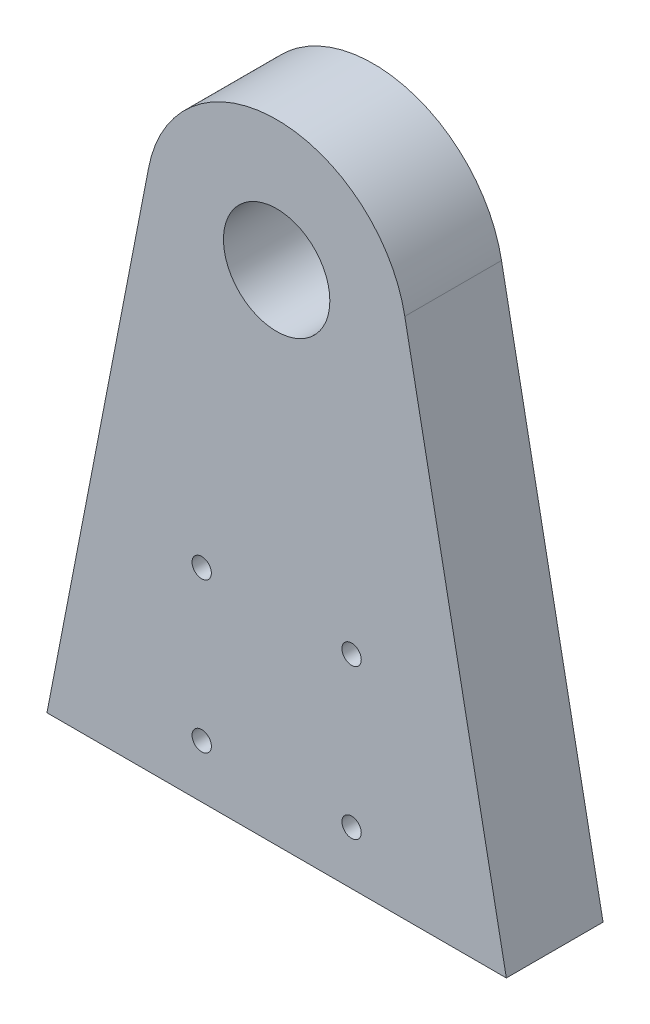
ISO-10303-21;
HEADER;
FILE_DESCRIPTION(('STEP AP214'),'2;1');
FILE_NAME('part.step','',(''),(''),'','','');
FILE_SCHEMA(('AUTOMOTIVE_DESIGN { 1 0 10303 214 1 1 1 1 }'));
ENDSEC;
DATA;
#1=APPLICATION_CONTEXT('core data for automotive mechanical design processes');
#2=APPLICATION_PROTOCOL_DEFINITION('international standard','automotive_design',2000,#1);
#3=PRODUCT_CONTEXT('',#1,'mechanical');
#4=PRODUCT('Part','Part','',(#3));
#5=PRODUCT_RELATED_PRODUCT_CATEGORY('part','',(#4));
#6=PRODUCT_DEFINITION_FORMATION('','',#4);
#7=PRODUCT_DEFINITION_CONTEXT('part definition',#1,'design');
#8=PRODUCT_DEFINITION('design','',#6,#7);
#9=PRODUCT_DEFINITION_SHAPE('','',#8);
#10=(LENGTH_UNIT() NAMED_UNIT(*) SI_UNIT(.MILLI.,.METRE.));
#11=(NAMED_UNIT(*) PLANE_ANGLE_UNIT() SI_UNIT($,.RADIAN.));
#12=(NAMED_UNIT(*) SI_UNIT($,.STERADIAN.) SOLID_ANGLE_UNIT());
#13=UNCERTAINTY_MEASURE_WITH_UNIT(LENGTH_MEASURE(1.E-05),#10,'distance_accuracy_value','');
#14=(GEOMETRIC_REPRESENTATION_CONTEXT(3) GLOBAL_UNCERTAINTY_ASSIGNED_CONTEXT((#13)) GLOBAL_UNIT_ASSIGNED_CONTEXT((#10,
#11,#12)) REPRESENTATION_CONTEXT('',''));
#15=CARTESIAN_POINT('',(0.,0.,0.));
#16=DIRECTION('',(0.,0.,1.));
#17=DIRECTION('',(1.,0.,0.));
#18=AXIS2_PLACEMENT_3D('',#15,#16,#17);
#19=CARTESIAN_POINT('',(47.5,103.039772727273,20.));
#20=DIRECTION('',(0.,0.,1.));
#21=DIRECTION('',(1.,0.,0.));
#22=AXIS2_PLACEMENT_3D('',#19,#20,#21);
#23=PLANE('',#22);
#24=CARTESIAN_POINT('',(62.9999999999999,42.,20.));
#25=DIRECTION('',(0.,0.,1.));
#26=DIRECTION('',(1.,0.,0.));
#27=AXIS2_PLACEMENT_3D('',#24,#25,#26);
#28=CIRCLE('',#27,2.);
#29=CARTESIAN_POINT('',(64.9999999999999,42.,20.));
#30=VERTEX_POINT('',#29);
#31=EDGE_CURVE('E137',#30,#30,#28,.T.);
#32=ORIENTED_EDGE('',*,*,#31,.F.);
#33=EDGE_LOOP('',(#32));
#34=FACE_BOUND('',#33,.T.);
#35=CARTESIAN_POINT('',(31.9999999999999,41.9999999999998,20.));
#36=DIRECTION('',(0.,0.,1.));
#37=DIRECTION('',(1.,0.,0.));
#38=AXIS2_PLACEMENT_3D('',#35,#36,#37);
#39=CIRCLE('',#38,2.);
#40=CARTESIAN_POINT('',(33.9999999999999,41.9999999999998,20.));
#41=VERTEX_POINT('',#40);
#42=EDGE_CURVE('E143',#41,#41,#39,.T.);
#43=ORIENTED_EDGE('',*,*,#42,.F.);
#44=EDGE_LOOP('',(#43));
#45=FACE_BOUND('',#44,.T.);
#46=CARTESIAN_POINT('',(32.,10.9999999999998,20.));
#47=DIRECTION('',(0.,0.,1.));
#48=DIRECTION('',(1.,0.,0.));
#49=AXIS2_PLACEMENT_3D('',#46,#47,#48);
#50=CIRCLE('',#49,2.);
#51=CARTESIAN_POINT('',(34.,10.9999999999998,20.));
#52=VERTEX_POINT('',#51);
#53=EDGE_CURVE('E149',#52,#52,#50,.T.);
#54=ORIENTED_EDGE('',*,*,#53,.F.);
#55=EDGE_LOOP('',(#54));
#56=FACE_BOUND('',#55,.T.);
#57=CARTESIAN_POINT('',(63.,11.,20.));
#58=DIRECTION('',(0.,0.,1.));
#59=DIRECTION('',(1.,0.,0.));
#60=AXIS2_PLACEMENT_3D('',#57,#58,#59);
#61=CIRCLE('',#60,2.);
#62=CARTESIAN_POINT('',(65.,11.,20.));
#63=VERTEX_POINT('',#62);
#64=EDGE_CURVE('E131',#63,#63,#61,.T.);
#65=ORIENTED_EDGE('',*,*,#64,.F.);
#66=EDGE_LOOP('',(#65));
#67=FACE_BOUND('',#66,.T.);
#68=DIRECTION('',(-0.190869659102224,-0.981615389668582,0.));
#69=VECTOR('',#68,1.);
#70=CARTESIAN_POINT('',(21.,108.,20.));
#71=LINE('',#70,#69);
#72=CARTESIAN_POINT('',(21.,108.,20.));
#73=VERTEX_POINT('',#72);
#74=CARTESIAN_POINT('',(0.,0.,20.));
#75=VERTEX_POINT('',#74);
#76=EDGE_CURVE('E98',#73,#75,#71,.T.);
#77=ORIENTED_EDGE('',*,*,#76,.T.);
#78=DIRECTION('',(1.,0.,0.));
#79=VECTOR('',#78,1.);
#80=CARTESIAN_POINT('',(0.,0.,20.));
#81=LINE('',#80,#79);
#82=CARTESIAN_POINT('',(95.,0.,20.));
#83=VERTEX_POINT('',#82);
#84=EDGE_CURVE('E93',#75,#83,#81,.T.);
#85=ORIENTED_EDGE('',*,*,#84,.T.);
#86=DIRECTION('',(-0.190869659102224,0.981615389668581,0.));
#87=VECTOR('',#86,1.);
#88=CARTESIAN_POINT('',(95.,0.,20.));
#89=LINE('',#88,#87);
#90=CARTESIAN_POINT('',(74.,108.,20.));
#91=VERTEX_POINT('',#90);
#92=EDGE_CURVE('E96',#83,#91,#89,.T.);
#93=ORIENTED_EDGE('',*,*,#92,.T.);
#94=CARTESIAN_POINT('',(47.5,103.039772727273,20.));
#95=DIRECTION('',(0.,0.,1.));
#96=DIRECTION('',(1.,0.,0.));
#97=AXIS2_PLACEMENT_3D('',#94,#95,#96);
#98=CIRCLE('',#97,26.9602272727273);
#99=EDGE_CURVE('E63',#91,#73,#98,.T.);
#100=ORIENTED_EDGE('',*,*,#99,.T.);
#101=EDGE_LOOP('',(#77,#85,#93,#100));
#102=FACE_BOUND('',#101,.T.);
#103=CARTESIAN_POINT('',(47.5,103.039772727273,20.));
#104=DIRECTION('',(0.,0.,1.));
#105=DIRECTION('',(1.,0.,0.));
#106=AXIS2_PLACEMENT_3D('',#103,#104,#105);
#107=CIRCLE('',#106,11.);
#108=CARTESIAN_POINT('',(58.5,103.039772727273,20.));
#109=VERTEX_POINT('',#108);
#110=EDGE_CURVE('E113',#109,#109,#107,.T.);
#111=ORIENTED_EDGE('',*,*,#110,.F.);
#112=EDGE_LOOP('',(#111));
#113=FACE_BOUND('',#112,.T.);
#114=ADVANCED_FACE('F46',(#34,#45,#56,#67,#102,#113),#23,.T.);
#115=CARTESIAN_POINT('',(47.5,103.039772727273,0.));
#116=DIRECTION('',(0.,0.,1.));
#117=DIRECTION('',(1.,0.,0.));
#118=AXIS2_PLACEMENT_3D('',#115,#116,#117);
#119=PLANE('',#118);
#120=CARTESIAN_POINT('',(62.9999999999999,42.,0.));
#121=DIRECTION('',(0.,0.,1.));
#122=DIRECTION('',(1.,0.,0.));
#123=AXIS2_PLACEMENT_3D('',#120,#121,#122);
#124=CIRCLE('',#123,2.);
#125=CARTESIAN_POINT('',(64.9999999999999,42.,0.));
#126=VERTEX_POINT('',#125);
#127=EDGE_CURVE('E140',#126,#126,#124,.T.);
#128=ORIENTED_EDGE('',*,*,#127,.T.);
#129=EDGE_LOOP('',(#128));
#130=FACE_BOUND('',#129,.T.);
#131=CARTESIAN_POINT('',(31.9999999999999,41.9999999999998,0.));
#132=DIRECTION('',(0.,0.,1.));
#133=DIRECTION('',(1.,0.,0.));
#134=AXIS2_PLACEMENT_3D('',#131,#132,#133);
#135=CIRCLE('',#134,2.);
#136=CARTESIAN_POINT('',(33.9999999999999,41.9999999999998,0.));
#137=VERTEX_POINT('',#136);
#138=EDGE_CURVE('E146',#137,#137,#135,.T.);
#139=ORIENTED_EDGE('',*,*,#138,.T.);
#140=EDGE_LOOP('',(#139));
#141=FACE_BOUND('',#140,.T.);
#142=CARTESIAN_POINT('',(32.,10.9999999999998,0.));
#143=DIRECTION('',(0.,0.,1.));
#144=DIRECTION('',(1.,0.,0.));
#145=AXIS2_PLACEMENT_3D('',#142,#143,#144);
#146=CIRCLE('',#145,2.);
#147=CARTESIAN_POINT('',(34.,10.9999999999998,0.));
#148=VERTEX_POINT('',#147);
#149=EDGE_CURVE('E134',#148,#148,#146,.T.);
#150=ORIENTED_EDGE('',*,*,#149,.T.);
#151=EDGE_LOOP('',(#150));
#152=FACE_BOUND('',#151,.T.);
#153=CARTESIAN_POINT('',(63.,11.,0.));
#154=DIRECTION('',(0.,0.,1.));
#155=DIRECTION('',(1.,0.,0.));
#156=AXIS2_PLACEMENT_3D('',#153,#154,#155);
#157=CIRCLE('',#156,2.);
#158=CARTESIAN_POINT('',(65.,11.,0.));
#159=VERTEX_POINT('',#158);
#160=EDGE_CURVE('E128',#159,#159,#157,.T.);
#161=ORIENTED_EDGE('',*,*,#160,.T.);
#162=EDGE_LOOP('',(#161));
#163=FACE_BOUND('',#162,.T.);
#164=DIRECTION('',(-0.190869659102224,-0.981615389668582,0.));
#165=VECTOR('',#164,1.);
#166=CARTESIAN_POINT('',(21.,108.,0.));
#167=LINE('',#166,#165);
#168=CARTESIAN_POINT('',(21.,108.,0.));
#169=VERTEX_POINT('',#168);
#170=CARTESIAN_POINT('',(0.,0.,0.));
#171=VERTEX_POINT('',#170);
#172=EDGE_CURVE('E110',#169,#171,#167,.T.);
#173=ORIENTED_EDGE('',*,*,#172,.F.);
#174=CARTESIAN_POINT('',(47.5,103.039772727273,0.));
#175=DIRECTION('',(0.,0.,1.));
#176=DIRECTION('',(1.,0.,0.));
#177=AXIS2_PLACEMENT_3D('',#174,#175,#176);
#178=CIRCLE('',#177,26.9602272727273);
#179=CARTESIAN_POINT('',(74.,108.,0.));
#180=VERTEX_POINT('',#179);
#181=EDGE_CURVE('E86',#180,#169,#178,.T.);
#182=ORIENTED_EDGE('',*,*,#181,.F.);
#183=DIRECTION('',(-0.190869659102224,0.981615389668581,0.));
#184=VECTOR('',#183,1.);
#185=CARTESIAN_POINT('',(95.,0.,0.));
#186=LINE('',#185,#184);
#187=CARTESIAN_POINT('',(95.,0.,0.));
#188=VERTEX_POINT('',#187);
#189=EDGE_CURVE('E80',#188,#180,#186,.T.);
#190=ORIENTED_EDGE('',*,*,#189,.F.);
#191=DIRECTION('',(1.,0.,0.));
#192=VECTOR('',#191,1.);
#193=CARTESIAN_POINT('',(0.,0.,0.));
#194=LINE('',#193,#192);
#195=EDGE_CURVE('E102',#171,#188,#194,.T.);
#196=ORIENTED_EDGE('',*,*,#195,.F.);
#197=EDGE_LOOP('',(#173,#182,#190,#196));
#198=FACE_BOUND('',#197,.T.);
#199=CARTESIAN_POINT('',(47.5,103.039772727273,0.));
#200=DIRECTION('',(0.,0.,1.));
#201=DIRECTION('',(1.,0.,0.));
#202=AXIS2_PLACEMENT_3D('',#199,#200,#201);
#203=CIRCLE('',#202,11.);
#204=CARTESIAN_POINT('',(58.5,103.039772727273,0.));
#205=VERTEX_POINT('',#204);
#206=EDGE_CURVE('E125',#205,#205,#203,.T.);
#207=ORIENTED_EDGE('',*,*,#206,.T.);
#208=EDGE_LOOP('',(#207));
#209=FACE_BOUND('',#208,.T.);
#210=ADVANCED_FACE('F121',(#130,#141,#152,#163,#198,#209),#119,.F.);
#211=CARTESIAN_POINT('',(21.,108.,20.));
#212=DIRECTION('',(0.981615389668581,-0.190869659102224,0.));
#213=DIRECTION('',(0.190869659102224,0.981615389668581,0.));
#214=AXIS2_PLACEMENT_3D('',#211,#212,#213);
#215=PLANE('',#214);
#216=ORIENTED_EDGE('',*,*,#172,.T.);
#217=DIRECTION('',(0.,0.,-1.));
#218=VECTOR('',#217,1.);
#219=CARTESIAN_POINT('',(0.,0.,20.));
#220=LINE('',#219,#218);
#221=EDGE_CURVE('E13',#75,#171,#220,.T.);
#222=ORIENTED_EDGE('',*,*,#221,.F.);
#223=ORIENTED_EDGE('',*,*,#76,.F.);
#224=DIRECTION('',(0.,0.,-1.));
#225=VECTOR('',#224,1.);
#226=CARTESIAN_POINT('',(21.,108.,20.));
#227=LINE('',#226,#225);
#228=EDGE_CURVE('E106',#73,#169,#227,.T.);
#229=ORIENTED_EDGE('',*,*,#228,.T.);
#230=EDGE_LOOP('',(#216,#222,#223,#229));
#231=FACE_BOUND('',#230,.T.);
#232=ADVANCED_FACE('F48',(#231),#215,.F.);
#233=CARTESIAN_POINT('',(0.,0.,20.));
#234=DIRECTION('',(0.,1.,0.));
#235=DIRECTION('',(-1.,0.,0.));
#236=AXIS2_PLACEMENT_3D('',#233,#234,#235);
#237=PLANE('',#236);
#238=ORIENTED_EDGE('',*,*,#195,.T.);
#239=DIRECTION('',(0.,0.,-1.));
#240=VECTOR('',#239,1.);
#241=CARTESIAN_POINT('',(95.,0.,20.));
#242=LINE('',#241,#240);
#243=EDGE_CURVE('E55',#83,#188,#242,.T.);
#244=ORIENTED_EDGE('',*,*,#243,.F.);
#245=ORIENTED_EDGE('',*,*,#84,.F.);
#246=ORIENTED_EDGE('',*,*,#221,.T.);
#247=EDGE_LOOP('',(#238,#244,#245,#246));
#248=FACE_BOUND('',#247,.T.);
#249=ADVANCED_FACE('F101',(#248),#237,.F.);
#250=CARTESIAN_POINT('',(95.,0.,20.));
#251=DIRECTION('',(-0.981615389668581,-0.190869659102224,0.));
#252=DIRECTION('',(0.190869659102224,-0.981615389668581,0.));
#253=AXIS2_PLACEMENT_3D('',#250,#251,#252);
#254=PLANE('',#253);
#255=ORIENTED_EDGE('',*,*,#189,.T.);
#256=DIRECTION('',(0.,0.,-1.));
#257=VECTOR('',#256,1.);
#258=CARTESIAN_POINT('',(74.,108.,20.));
#259=LINE('',#258,#257);
#260=EDGE_CURVE('E103',#91,#180,#259,.T.);
#261=ORIENTED_EDGE('',*,*,#260,.F.);
#262=ORIENTED_EDGE('',*,*,#92,.F.);
#263=ORIENTED_EDGE('',*,*,#243,.T.);
#264=EDGE_LOOP('',(#255,#261,#262,#263));
#265=FACE_BOUND('',#264,.T.);
#266=ADVANCED_FACE('F104',(#265),#254,.F.);
#267=CARTESIAN_POINT('',(47.5,103.039772727273,20.));
#268=DIRECTION('',(0.,0.,-1.));
#269=DIRECTION('',(-1.,0.,0.));
#270=AXIS2_PLACEMENT_3D('',#267,#268,#269);
#271=CYLINDRICAL_SURFACE('',#270,26.9602272727273);
#272=ORIENTED_EDGE('',*,*,#181,.T.);
#273=ORIENTED_EDGE('',*,*,#228,.F.);
#274=ORIENTED_EDGE('',*,*,#99,.F.);
#275=ORIENTED_EDGE('',*,*,#260,.T.);
#276=EDGE_LOOP('',(#272,#273,#274,#275));
#277=FACE_BOUND('',#276,.T.);
#278=ADVANCED_FACE('F118',(#277),#271,.T.);
#279=CARTESIAN_POINT('',(47.5,103.039772727273,20.));
#280=DIRECTION('',(0.,0.,-1.));
#281=DIRECTION('',(-1.,0.,0.));
#282=AXIS2_PLACEMENT_3D('',#279,#280,#281);
#283=CYLINDRICAL_SURFACE('',#282,11.);
#284=ORIENTED_EDGE('',*,*,#110,.T.);
#285=EDGE_LOOP('',(#284));
#286=FACE_BOUND('',#285,.T.);
#287=ORIENTED_EDGE('',*,*,#206,.F.);
#288=EDGE_LOOP('',(#287));
#289=FACE_BOUND('',#288,.T.);
#290=ADVANCED_FACE('F172',(#286,#289),#283,.F.);
#291=CARTESIAN_POINT('',(63.,11.,0.));
#292=DIRECTION('',(0.,0.,1.));
#293=DIRECTION('',(1.,0.,0.));
#294=AXIS2_PLACEMENT_3D('',#291,#292,#293);
#295=CYLINDRICAL_SURFACE('',#294,2.);
#296=ORIENTED_EDGE('',*,*,#160,.F.);
#297=EDGE_LOOP('',(#296));
#298=FACE_BOUND('',#297,.T.);
#299=ORIENTED_EDGE('',*,*,#64,.T.);
#300=EDGE_LOOP('',(#299));
#301=FACE_BOUND('',#300,.T.);
#302=ADVANCED_FACE('F161',(#298,#301),#295,.F.);
#303=CARTESIAN_POINT('',(32.,10.9999999999998,0.));
#304=DIRECTION('',(0.,0.,1.));
#305=DIRECTION('',(1.,0.,0.));
#306=AXIS2_PLACEMENT_3D('',#303,#304,#305);
#307=CYLINDRICAL_SURFACE('',#306,2.);
#308=ORIENTED_EDGE('',*,*,#149,.F.);
#309=EDGE_LOOP('',(#308));
#310=FACE_BOUND('',#309,.T.);
#311=ORIENTED_EDGE('',*,*,#53,.T.);
#312=EDGE_LOOP('',(#311));
#313=FACE_BOUND('',#312,.T.);
#314=ADVANCED_FACE('F157',(#310,#313),#307,.F.);
#315=CARTESIAN_POINT('',(31.9999999999999,41.9999999999998,0.));
#316=DIRECTION('',(0.,0.,1.));
#317=DIRECTION('',(1.,0.,0.));
#318=AXIS2_PLACEMENT_3D('',#315,#316,#317);
#319=CYLINDRICAL_SURFACE('',#318,2.);
#320=ORIENTED_EDGE('',*,*,#138,.F.);
#321=EDGE_LOOP('',(#320));
#322=FACE_BOUND('',#321,.T.);
#323=ORIENTED_EDGE('',*,*,#42,.T.);
#324=EDGE_LOOP('',(#323));
#325=FACE_BOUND('',#324,.T.);
#326=ADVANCED_FACE('F160',(#322,#325),#319,.F.);
#327=CARTESIAN_POINT('',(62.9999999999999,42.,0.));
#328=DIRECTION('',(0.,0.,1.));
#329=DIRECTION('',(1.,0.,0.));
#330=AXIS2_PLACEMENT_3D('',#327,#328,#329);
#331=CYLINDRICAL_SURFACE('',#330,2.);
#332=ORIENTED_EDGE('',*,*,#127,.F.);
#333=EDGE_LOOP('',(#332));
#334=FACE_BOUND('',#333,.T.);
#335=ORIENTED_EDGE('',*,*,#31,.T.);
#336=EDGE_LOOP('',(#335));
#337=FACE_BOUND('',#336,.T.);
#338=ADVANCED_FACE('F182',(#334,#337),#331,.F.);
#339=CLOSED_SHELL('',(#114,#210,#232,#249,#266,#278,#290,#302,#314,#326,#338));
#340=MANIFOLD_SOLID_BREP('B2',#339);
#341=ADVANCED_BREP_SHAPE_REPRESENTATION('',(#18,#340),#14);
#342=SHAPE_DEFINITION_REPRESENTATION(#9,#341);
ENDSEC;
END-ISO-10303-21;
